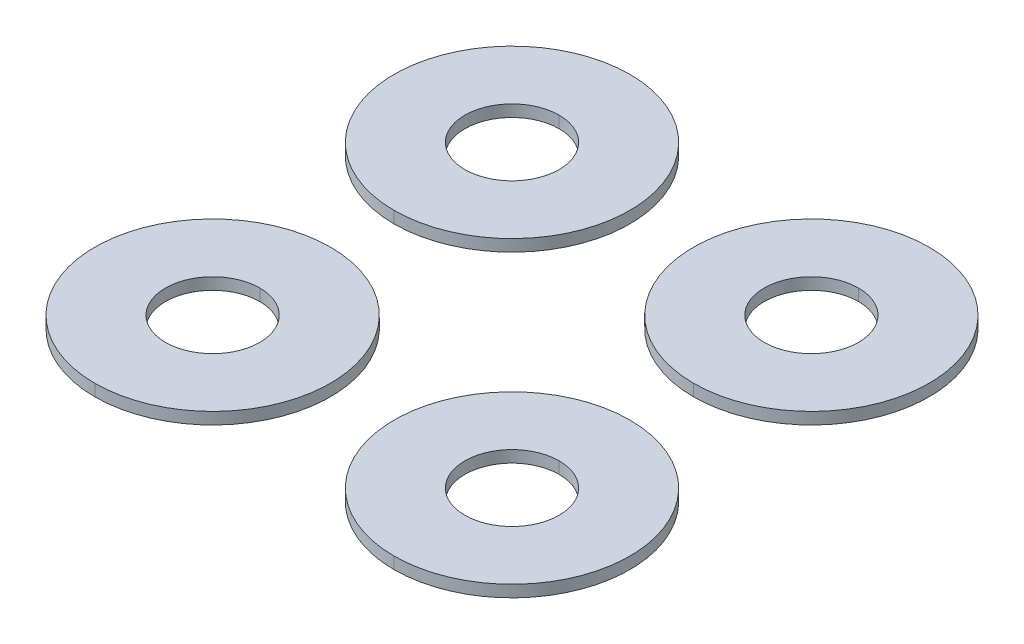
ISO-10303-21;
HEADER;
FILE_DESCRIPTION(('STEP AP214'),'2;1');
FILE_NAME('part.step','',(''),(''),'','','');
FILE_SCHEMA(('AUTOMOTIVE_DESIGN { 1 0 10303 214 1 1 1 1 }'));
ENDSEC;
DATA;
#1=APPLICATION_CONTEXT('core data for automotive mechanical design processes');
#2=APPLICATION_PROTOCOL_DEFINITION('international standard','automotive_design',2000,#1);
#3=PRODUCT_CONTEXT('',#1,'mechanical');
#4=PRODUCT('Part','Part','',(#3));
#5=PRODUCT_RELATED_PRODUCT_CATEGORY('part','',(#4));
#6=PRODUCT_DEFINITION_FORMATION('','',#4);
#7=PRODUCT_DEFINITION_CONTEXT('part definition',#1,'design');
#8=PRODUCT_DEFINITION('design','',#6,#7);
#9=PRODUCT_DEFINITION_SHAPE('','',#8);
#10=(LENGTH_UNIT() NAMED_UNIT(*) SI_UNIT(.MILLI.,.METRE.));
#11=(NAMED_UNIT(*) PLANE_ANGLE_UNIT() SI_UNIT($,.RADIAN.));
#12=(NAMED_UNIT(*) SI_UNIT($,.STERADIAN.) SOLID_ANGLE_UNIT());
#13=UNCERTAINTY_MEASURE_WITH_UNIT(LENGTH_MEASURE(1.E-05),#10,'distance_accuracy_value','');
#14=(GEOMETRIC_REPRESENTATION_CONTEXT(3) GLOBAL_UNCERTAINTY_ASSIGNED_CONTEXT((#13)) GLOBAL_UNIT_ASSIGNED_CONTEXT((#10,
#11,#12)) REPRESENTATION_CONTEXT('',''));
#15=CARTESIAN_POINT('',(0.,0.,0.));
#16=DIRECTION('',(0.,0.,1.));
#17=DIRECTION('',(1.,0.,0.));
#18=AXIS2_PLACEMENT_3D('',#15,#16,#17);
#19=CARTESIAN_POINT('',(0.,0.1,0.));
#20=DIRECTION('',(0.,-1.,0.));
#21=DIRECTION('',(0.,0.,-1.));
#22=AXIS2_PLACEMENT_3D('',#19,#20,#21);
#23=CYLINDRICAL_SURFACE('',#22,0.4);
#24=DIRECTION('',(0.,-1.,0.));
#25=VECTOR('',#24,1.);
#26=CARTESIAN_POINT('',(0.,0.1,0.4));
#27=LINE('',#26,#25);
#28=CARTESIAN_POINT('',(0.,0.1,0.4));
#29=VERTEX_POINT('',#28);
#30=CARTESIAN_POINT('',(0.,0.,0.4));
#31=VERTEX_POINT('',#30);
#32=EDGE_CURVE('P0_E110',#29,#31,#27,.T.);
#33=ORIENTED_EDGE('',*,*,#32,.F.);
#34=CARTESIAN_POINT('',(0.,0.1,0.));
#35=DIRECTION('',(0.,1.,0.));
#36=DIRECTION('',(0.,0.,1.));
#37=AXIS2_PLACEMENT_3D('',#34,#35,#36);
#38=CIRCLE('',#37,0.4);
#39=CARTESIAN_POINT('',(0.,0.1,-0.4));
#40=VERTEX_POINT('',#39);
#41=EDGE_CURVE('P0_E58',#29,#40,#38,.T.);
#42=ORIENTED_EDGE('',*,*,#41,.T.);
#43=DIRECTION('',(0.,-1.,0.));
#44=VECTOR('',#43,1.);
#45=CARTESIAN_POINT('',(0.,0.1,-0.4));
#46=LINE('',#45,#44);
#47=CARTESIAN_POINT('',(0.,0.,-0.4));
#48=VERTEX_POINT('',#47);
#49=EDGE_CURVE('P0_E100',#40,#48,#46,.T.);
#50=ORIENTED_EDGE('',*,*,#49,.T.);
#51=CARTESIAN_POINT('',(0.,0.,0.));
#52=DIRECTION('',(0.,1.,0.));
#53=DIRECTION('',(0.,0.,1.));
#54=AXIS2_PLACEMENT_3D('',#51,#52,#53);
#55=CIRCLE('',#54,0.4);
#56=EDGE_CURVE('P0_E11',#31,#48,#55,.T.);
#57=ORIENTED_EDGE('',*,*,#56,.F.);
#58=EDGE_LOOP('',(#33,#42,#50,#57));
#59=FACE_BOUND('',#58,.T.);
#60=ADVANCED_FACE('P0_F16',(#59),#23,.F.);
#61=CARTESIAN_POINT('',(0.,0.1,0.));
#62=DIRECTION('',(0.,-1.,0.));
#63=DIRECTION('',(0.,0.,-1.));
#64=AXIS2_PLACEMENT_3D('',#61,#62,#63);
#65=CYLINDRICAL_SURFACE('',#64,1.);
#66=DIRECTION('',(0.,-1.,0.));
#67=VECTOR('',#66,1.);
#68=CARTESIAN_POINT('',(0.,0.1,1.));
#69=LINE('',#68,#67);
#70=CARTESIAN_POINT('',(0.,0.1,1.));
#71=VERTEX_POINT('',#70);
#72=CARTESIAN_POINT('',(0.,0.,1.));
#73=VERTEX_POINT('',#72);
#74=EDGE_CURVE('P0_E92',#71,#73,#69,.T.);
#75=ORIENTED_EDGE('',*,*,#74,.F.);
#76=CARTESIAN_POINT('',(0.,0.1,0.));
#77=DIRECTION('',(0.,1.,0.));
#78=DIRECTION('',(0.,0.,1.));
#79=AXIS2_PLACEMENT_3D('',#76,#77,#78);
#80=CIRCLE('',#79,1.);
#81=CARTESIAN_POINT('',(0.,0.1,-1.));
#82=VERTEX_POINT('',#81);
#83=EDGE_CURVE('P0_E78',#82,#71,#80,.T.);
#84=ORIENTED_EDGE('',*,*,#83,.F.);
#85=DIRECTION('',(0.,-1.,0.));
#86=VECTOR('',#85,1.);
#87=CARTESIAN_POINT('',(0.,0.1,-1.));
#88=LINE('',#87,#86);
#89=CARTESIAN_POINT('',(0.,0.,-1.));
#90=VERTEX_POINT('',#89);
#91=EDGE_CURVE('P0_E89',#82,#90,#88,.T.);
#92=ORIENTED_EDGE('',*,*,#91,.T.);
#93=CARTESIAN_POINT('',(0.,0.,0.));
#94=DIRECTION('',(0.,1.,0.));
#95=DIRECTION('',(0.,0.,1.));
#96=AXIS2_PLACEMENT_3D('',#93,#94,#95);
#97=CIRCLE('',#96,1.);
#98=EDGE_CURVE('P0_E27',#90,#73,#97,.T.);
#99=ORIENTED_EDGE('',*,*,#98,.T.);
#100=EDGE_LOOP('',(#75,#84,#92,#99));
#101=FACE_BOUND('',#100,.T.);
#102=ADVANCED_FACE('P0_F18',(#101),#65,.T.);
#103=CARTESIAN_POINT('',(0.,0.,0.));
#104=DIRECTION('',(0.,1.,0.));
#105=DIRECTION('',(1.,0.,0.));
#106=AXIS2_PLACEMENT_3D('',#103,#104,#105);
#107=PLANE('',#106);
#108=CARTESIAN_POINT('',(0.,0.,0.));
#109=DIRECTION('',(0.,1.,0.));
#110=DIRECTION('',(0.,0.,1.));
#111=AXIS2_PLACEMENT_3D('',#108,#109,#110);
#112=CIRCLE('',#111,0.4);
#113=EDGE_CURVE('P0_E20',#48,#31,#112,.T.);
#114=ORIENTED_EDGE('',*,*,#113,.T.);
#115=ORIENTED_EDGE('',*,*,#56,.T.);
#116=EDGE_LOOP('',(#114,#115));
#117=FACE_BOUND('',#116,.T.);
#118=ORIENTED_EDGE('',*,*,#98,.F.);
#119=CARTESIAN_POINT('',(0.,0.,0.));
#120=DIRECTION('',(0.,1.,0.));
#121=DIRECTION('',(0.,0.,1.));
#122=AXIS2_PLACEMENT_3D('',#119,#120,#121);
#123=CIRCLE('',#122,1.);
#124=EDGE_CURVE('P0_E96',#73,#90,#123,.T.);
#125=ORIENTED_EDGE('',*,*,#124,.F.);
#126=EDGE_LOOP('',(#118,#125));
#127=FACE_BOUND('',#126,.T.);
#128=ADVANCED_FACE('P0_F140',(#117,#127),#107,.F.);
#129=CARTESIAN_POINT('',(0.,0.1,0.));
#130=DIRECTION('',(0.,1.,0.));
#131=DIRECTION('',(1.,0.,0.));
#132=AXIS2_PLACEMENT_3D('',#129,#130,#131);
#133=PLANE('',#132);
#134=CARTESIAN_POINT('',(0.,0.1,0.));
#135=DIRECTION('',(0.,1.,0.));
#136=DIRECTION('',(0.,0.,1.));
#137=AXIS2_PLACEMENT_3D('',#134,#135,#136);
#138=CIRCLE('',#137,0.4);
#139=EDGE_CURVE('P0_E107',#40,#29,#138,.T.);
#140=ORIENTED_EDGE('',*,*,#139,.F.);
#141=ORIENTED_EDGE('',*,*,#41,.F.);
#142=EDGE_LOOP('',(#140,#141));
#143=FACE_BOUND('',#142,.T.);
#144=ORIENTED_EDGE('',*,*,#83,.T.);
#145=CARTESIAN_POINT('',(0.,0.1,0.));
#146=DIRECTION('',(0.,1.,0.));
#147=DIRECTION('',(0.,0.,1.));
#148=AXIS2_PLACEMENT_3D('',#145,#146,#147);
#149=CIRCLE('',#148,1.);
#150=EDGE_CURVE('P0_E87',#71,#82,#149,.T.);
#151=ORIENTED_EDGE('',*,*,#150,.T.);
#152=EDGE_LOOP('',(#144,#151));
#153=FACE_BOUND('',#152,.T.);
#154=ADVANCED_FACE('P0_F85',(#143,#153),#133,.T.);
#155=CARTESIAN_POINT('',(0.,0.1,0.));
#156=DIRECTION('',(0.,-1.,0.));
#157=DIRECTION('',(0.,0.,-1.));
#158=AXIS2_PLACEMENT_3D('',#155,#156,#157);
#159=CYLINDRICAL_SURFACE('',#158,1.);
#160=ORIENTED_EDGE('',*,*,#150,.F.);
#161=ORIENTED_EDGE('',*,*,#74,.T.);
#162=ORIENTED_EDGE('',*,*,#124,.T.);
#163=ORIENTED_EDGE('',*,*,#91,.F.);
#164=EDGE_LOOP('',(#160,#161,#162,#163));
#165=FACE_BOUND('',#164,.T.);
#166=ADVANCED_FACE('P0_F98',(#165),#159,.T.);
#167=CARTESIAN_POINT('',(0.,0.1,0.));
#168=DIRECTION('',(0.,-1.,0.));
#169=DIRECTION('',(0.,0.,-1.));
#170=AXIS2_PLACEMENT_3D('',#167,#168,#169);
#171=CYLINDRICAL_SURFACE('',#170,0.4);
#172=ORIENTED_EDGE('',*,*,#139,.T.);
#173=ORIENTED_EDGE('',*,*,#32,.T.);
#174=ORIENTED_EDGE('',*,*,#113,.F.);
#175=ORIENTED_EDGE('',*,*,#49,.F.);
#176=EDGE_LOOP('',(#172,#173,#174,#175));
#177=FACE_BOUND('',#176,.T.);
#178=ADVANCED_FACE('P0_F150',(#177),#171,.F.);
#179=CLOSED_SHELL('',(#60,#102,#128,#154,#166,#178));
#180=MANIFOLD_SOLID_BREP('P0_B1',#179);
#181=CARTESIAN_POINT('',(0.,0.1,-2.54));
#182=DIRECTION('',(0.,-1.,0.));
#183=DIRECTION('',(0.,0.,-1.));
#184=AXIS2_PLACEMENT_3D('',#181,#182,#183);
#185=CYLINDRICAL_SURFACE('',#184,0.4);
#186=DIRECTION('',(0.,-1.,0.));
#187=VECTOR('',#186,1.);
#188=CARTESIAN_POINT('',(0.,0.1,-2.14));
#189=LINE('',#188,#187);
#190=CARTESIAN_POINT('',(0.,0.1,-2.14));
#191=VERTEX_POINT('',#190);
#192=CARTESIAN_POINT('',(0.,0.,-2.14));
#193=VERTEX_POINT('',#192);
#194=EDGE_CURVE('P1_E117',#191,#193,#189,.T.);
#195=ORIENTED_EDGE('',*,*,#194,.F.);
#196=CARTESIAN_POINT('',(0.,0.1,-2.54));
#197=DIRECTION('',(0.,1.,0.));
#198=DIRECTION('',(0.,0.,1.));
#199=AXIS2_PLACEMENT_3D('',#196,#197,#198);
#200=CIRCLE('',#199,0.4);
#201=CARTESIAN_POINT('',(0.,0.1,-2.94));
#202=VERTEX_POINT('',#201);
#203=EDGE_CURVE('P1_E59',#191,#202,#200,.T.);
#204=ORIENTED_EDGE('',*,*,#203,.T.);
#205=DIRECTION('',(0.,-1.,0.));
#206=VECTOR('',#205,1.);
#207=CARTESIAN_POINT('',(0.,0.1,-2.94));
#208=LINE('',#207,#206);
#209=CARTESIAN_POINT('',(0.,0.,-2.94));
#210=VERTEX_POINT('',#209);
#211=EDGE_CURVE('P1_E96',#202,#210,#208,.T.);
#212=ORIENTED_EDGE('',*,*,#211,.T.);
#213=CARTESIAN_POINT('',(0.,0.,-2.54));
#214=DIRECTION('',(0.,1.,0.));
#215=DIRECTION('',(0.,0.,1.));
#216=AXIS2_PLACEMENT_3D('',#213,#214,#215);
#217=CIRCLE('',#216,0.4);
#218=EDGE_CURVE('P1_E11',#193,#210,#217,.T.);
#219=ORIENTED_EDGE('',*,*,#218,.F.);
#220=EDGE_LOOP('',(#195,#204,#212,#219));
#221=FACE_BOUND('',#220,.T.);
#222=ADVANCED_FACE('P1_F16',(#221),#185,.F.);
#223=CARTESIAN_POINT('',(0.,0.1,-2.54));
#224=DIRECTION('',(0.,-1.,0.));
#225=DIRECTION('',(0.,0.,-1.));
#226=AXIS2_PLACEMENT_3D('',#223,#224,#225);
#227=CYLINDRICAL_SURFACE('',#226,1.);
#228=DIRECTION('',(0.,-1.,0.));
#229=VECTOR('',#228,1.);
#230=CARTESIAN_POINT('',(0.,0.1,-1.54));
#231=LINE('',#230,#229);
#232=CARTESIAN_POINT('',(0.,0.1,-1.54));
#233=VERTEX_POINT('',#232);
#234=CARTESIAN_POINT('',(0.,0.,-1.54));
#235=VERTEX_POINT('',#234);
#236=EDGE_CURVE('P1_E83',#233,#235,#231,.T.);
#237=ORIENTED_EDGE('',*,*,#236,.F.);
#238=CARTESIAN_POINT('',(0.,0.1,-2.54));
#239=DIRECTION('',(0.,1.,0.));
#240=DIRECTION('',(0.,0.,1.));
#241=AXIS2_PLACEMENT_3D('',#238,#239,#240);
#242=CIRCLE('',#241,1.);
#243=CARTESIAN_POINT('',(0.,0.1,-3.54));
#244=VERTEX_POINT('',#243);
#245=EDGE_CURVE('P1_E78',#244,#233,#242,.T.);
#246=ORIENTED_EDGE('',*,*,#245,.F.);
#247=DIRECTION('',(0.,-1.,0.));
#248=VECTOR('',#247,1.);
#249=CARTESIAN_POINT('',(0.,0.1,-3.54));
#250=LINE('',#249,#248);
#251=CARTESIAN_POINT('',(0.,0.,-3.54));
#252=VERTEX_POINT('',#251);
#253=EDGE_CURVE('P1_E20',#244,#252,#250,.T.);
#254=ORIENTED_EDGE('',*,*,#253,.T.);
#255=CARTESIAN_POINT('',(0.,0.,-2.54));
#256=DIRECTION('',(0.,1.,0.));
#257=DIRECTION('',(0.,0.,1.));
#258=AXIS2_PLACEMENT_3D('',#255,#256,#257);
#259=CIRCLE('',#258,1.);
#260=EDGE_CURVE('P1_E27',#252,#235,#259,.T.);
#261=ORIENTED_EDGE('',*,*,#260,.T.);
#262=EDGE_LOOP('',(#237,#246,#254,#261));
#263=FACE_BOUND('',#262,.T.);
#264=ADVANCED_FACE('P1_F80',(#263),#227,.T.);
#265=CARTESIAN_POINT('',(0.,0.,-2.54));
#266=DIRECTION('',(0.,1.,0.));
#267=DIRECTION('',(1.,0.,0.));
#268=AXIS2_PLACEMENT_3D('',#265,#266,#267);
#269=PLANE('',#268);
#270=CARTESIAN_POINT('',(0.,0.,-2.54));
#271=DIRECTION('',(0.,1.,0.));
#272=DIRECTION('',(0.,0.,1.));
#273=AXIS2_PLACEMENT_3D('',#270,#271,#272);
#274=CIRCLE('',#273,0.4);
#275=EDGE_CURVE('P1_E104',#210,#193,#274,.T.);
#276=ORIENTED_EDGE('',*,*,#275,.T.);
#277=ORIENTED_EDGE('',*,*,#218,.T.);
#278=EDGE_LOOP('',(#276,#277));
#279=FACE_BOUND('',#278,.T.);
#280=ORIENTED_EDGE('',*,*,#260,.F.);
#281=CARTESIAN_POINT('',(0.,0.,-2.54));
#282=DIRECTION('',(0.,1.,0.));
#283=DIRECTION('',(0.,0.,1.));
#284=AXIS2_PLACEMENT_3D('',#281,#282,#283);
#285=CIRCLE('',#284,1.);
#286=EDGE_CURVE('P1_E92',#235,#252,#285,.T.);
#287=ORIENTED_EDGE('',*,*,#286,.F.);
#288=EDGE_LOOP('',(#280,#287));
#289=FACE_BOUND('',#288,.T.);
#290=ADVANCED_FACE('P1_F18',(#279,#289),#269,.F.);
#291=CARTESIAN_POINT('',(0.,0.1,-2.54));
#292=DIRECTION('',(0.,1.,0.));
#293=DIRECTION('',(1.,0.,0.));
#294=AXIS2_PLACEMENT_3D('',#291,#292,#293);
#295=PLANE('',#294);
#296=CARTESIAN_POINT('',(0.,0.1,-2.54));
#297=DIRECTION('',(0.,1.,0.));
#298=DIRECTION('',(0.,0.,1.));
#299=AXIS2_PLACEMENT_3D('',#296,#297,#298);
#300=CIRCLE('',#299,0.4);
#301=EDGE_CURVE('P1_E115',#202,#191,#300,.T.);
#302=ORIENTED_EDGE('',*,*,#301,.F.);
#303=ORIENTED_EDGE('',*,*,#203,.F.);
#304=EDGE_LOOP('',(#302,#303));
#305=FACE_BOUND('',#304,.T.);
#306=ORIENTED_EDGE('',*,*,#245,.T.);
#307=CARTESIAN_POINT('',(0.,0.1,-2.54));
#308=DIRECTION('',(0.,1.,0.));
#309=DIRECTION('',(0.,0.,1.));
#310=AXIS2_PLACEMENT_3D('',#307,#308,#309);
#311=CIRCLE('',#310,1.);
#312=EDGE_CURVE('P1_E91',#233,#244,#311,.T.);
#313=ORIENTED_EDGE('',*,*,#312,.T.);
#314=EDGE_LOOP('',(#306,#313));
#315=FACE_BOUND('',#314,.T.);
#316=ADVANCED_FACE('P1_F94',(#305,#315),#295,.T.);
#317=CARTESIAN_POINT('',(0.,0.1,-2.54));
#318=DIRECTION('',(0.,-1.,0.));
#319=DIRECTION('',(0.,0.,-1.));
#320=AXIS2_PLACEMENT_3D('',#317,#318,#319);
#321=CYLINDRICAL_SURFACE('',#320,1.);
#322=ORIENTED_EDGE('',*,*,#312,.F.);
#323=ORIENTED_EDGE('',*,*,#236,.T.);
#324=ORIENTED_EDGE('',*,*,#286,.T.);
#325=ORIENTED_EDGE('',*,*,#253,.F.);
#326=EDGE_LOOP('',(#322,#323,#324,#325));
#327=FACE_BOUND('',#326,.T.);
#328=ADVANCED_FACE('P1_F90',(#327),#321,.T.);
#329=CARTESIAN_POINT('',(0.,0.1,-2.54));
#330=DIRECTION('',(0.,-1.,0.));
#331=DIRECTION('',(0.,0.,-1.));
#332=AXIS2_PLACEMENT_3D('',#329,#330,#331);
#333=CYLINDRICAL_SURFACE('',#332,0.4);
#334=ORIENTED_EDGE('',*,*,#301,.T.);
#335=ORIENTED_EDGE('',*,*,#194,.T.);
#336=ORIENTED_EDGE('',*,*,#275,.F.);
#337=ORIENTED_EDGE('',*,*,#211,.F.);
#338=EDGE_LOOP('',(#334,#335,#336,#337));
#339=FACE_BOUND('',#338,.T.);
#340=ADVANCED_FACE('P1_F167',(#339),#333,.F.);
#341=CLOSED_SHELL('',(#222,#264,#290,#316,#328,#340));
#342=MANIFOLD_SOLID_BREP('P1_B1',#341);
#343=CARTESIAN_POINT('',(2.54,0.1,-2.54));
#344=DIRECTION('',(0.,-1.,0.));
#345=DIRECTION('',(0.,0.,-1.));
#346=AXIS2_PLACEMENT_3D('',#343,#344,#345);
#347=CYLINDRICAL_SURFACE('',#346,0.4);
#348=DIRECTION('',(0.,-1.,0.));
#349=VECTOR('',#348,1.);
#350=CARTESIAN_POINT('',(2.54,0.1,-2.14));
#351=LINE('',#350,#349);
#352=CARTESIAN_POINT('',(2.54,0.1,-2.14));
#353=VERTEX_POINT('',#352);
#354=CARTESIAN_POINT('',(2.54,0.,-2.14));
#355=VERTEX_POINT('',#354);
#356=EDGE_CURVE('P2_E82',#353,#355,#351,.T.);
#357=ORIENTED_EDGE('',*,*,#356,.F.);
#358=CARTESIAN_POINT('',(2.54,0.1,-2.54));
#359=DIRECTION('',(0.,1.,0.));
#360=DIRECTION('',(0.,0.,1.));
#361=AXIS2_PLACEMENT_3D('',#358,#359,#360);
#362=CIRCLE('',#361,0.4);
#363=CARTESIAN_POINT('',(2.54,0.1,-2.94));
#364=VERTEX_POINT('',#363);
#365=EDGE_CURVE('P2_E71',#353,#364,#362,.T.);
#366=ORIENTED_EDGE('',*,*,#365,.T.);
#367=DIRECTION('',(0.,-1.,0.));
#368=VECTOR('',#367,1.);
#369=CARTESIAN_POINT('',(2.54,0.1,-2.94));
#370=LINE('',#369,#368);
#371=CARTESIAN_POINT('',(2.54,0.,-2.94));
#372=VERTEX_POINT('',#371);
#373=EDGE_CURVE('P2_E79',#364,#372,#370,.T.);
#374=ORIENTED_EDGE('',*,*,#373,.T.);
#375=CARTESIAN_POINT('',(2.54,0.,-2.54));
#376=DIRECTION('',(0.,1.,0.));
#377=DIRECTION('',(0.,0.,1.));
#378=AXIS2_PLACEMENT_3D('',#375,#376,#377);
#379=CIRCLE('',#378,0.4);
#380=EDGE_CURVE('P2_E11',#355,#372,#379,.T.);
#381=ORIENTED_EDGE('',*,*,#380,.F.);
#382=EDGE_LOOP('',(#357,#366,#374,#381));
#383=FACE_BOUND('',#382,.T.);
#384=ADVANCED_FACE('P2_F16',(#383),#347,.F.);
#385=CARTESIAN_POINT('',(2.54,0.1,-2.54));
#386=DIRECTION('',(0.,-1.,0.));
#387=DIRECTION('',(0.,0.,-1.));
#388=AXIS2_PLACEMENT_3D('',#385,#386,#387);
#389=CYLINDRICAL_SURFACE('',#388,1.);
#390=DIRECTION('',(0.,-1.,0.));
#391=VECTOR('',#390,1.);
#392=CARTESIAN_POINT('',(2.54,0.1,-1.54));
#393=LINE('',#392,#391);
#394=CARTESIAN_POINT('',(2.54,0.1,-1.54));
#395=VERTEX_POINT('',#394);
#396=CARTESIAN_POINT('',(2.54,0.,-1.54));
#397=VERTEX_POINT('',#396);
#398=EDGE_CURVE('P2_E113',#395,#397,#393,.T.);
#399=ORIENTED_EDGE('',*,*,#398,.F.);
#400=CARTESIAN_POINT('',(2.54,0.1,-2.54));
#401=DIRECTION('',(0.,1.,0.));
#402=DIRECTION('',(0.,0.,1.));
#403=AXIS2_PLACEMENT_3D('',#400,#401,#402);
#404=CIRCLE('',#403,1.);
#405=CARTESIAN_POINT('',(2.54,0.1,-3.54));
#406=VERTEX_POINT('',#405);
#407=EDGE_CURVE('P2_E20',#406,#395,#404,.T.);
#408=ORIENTED_EDGE('',*,*,#407,.F.);
#409=DIRECTION('',(0.,-1.,0.));
#410=VECTOR('',#409,1.);
#411=CARTESIAN_POINT('',(2.54,0.1,-3.54));
#412=LINE('',#411,#410);
#413=CARTESIAN_POINT('',(2.54,0.,-3.54));
#414=VERTEX_POINT('',#413);
#415=EDGE_CURVE('P2_E104',#406,#414,#412,.T.);
#416=ORIENTED_EDGE('',*,*,#415,.T.);
#417=CARTESIAN_POINT('',(2.54,0.,-2.54));
#418=DIRECTION('',(0.,1.,0.));
#419=DIRECTION('',(0.,0.,1.));
#420=AXIS2_PLACEMENT_3D('',#417,#418,#419);
#421=CIRCLE('',#420,1.);
#422=EDGE_CURVE('P2_E26',#414,#397,#421,.T.);
#423=ORIENTED_EDGE('',*,*,#422,.T.);
#424=EDGE_LOOP('',(#399,#408,#416,#423));
#425=FACE_BOUND('',#424,.T.);
#426=ADVANCED_FACE('P2_F18',(#425),#389,.T.);
#427=CARTESIAN_POINT('',(2.54,0.,-2.54));
#428=DIRECTION('',(0.,1.,0.));
#429=DIRECTION('',(1.,0.,0.));
#430=AXIS2_PLACEMENT_3D('',#427,#428,#429);
#431=PLANE('',#430);
#432=CARTESIAN_POINT('',(2.54,0.,-2.54));
#433=DIRECTION('',(0.,1.,0.));
#434=DIRECTION('',(0.,0.,1.));
#435=AXIS2_PLACEMENT_3D('',#432,#433,#434);
#436=CIRCLE('',#435,0.4);
#437=EDGE_CURVE('P2_E90',#372,#355,#436,.T.);
#438=ORIENTED_EDGE('',*,*,#437,.T.);
#439=ORIENTED_EDGE('',*,*,#380,.T.);
#440=EDGE_LOOP('',(#438,#439));
#441=FACE_BOUND('',#440,.T.);
#442=ORIENTED_EDGE('',*,*,#422,.F.);
#443=CARTESIAN_POINT('',(2.54,0.,-2.54));
#444=DIRECTION('',(0.,1.,0.));
#445=DIRECTION('',(0.,0.,1.));
#446=AXIS2_PLACEMENT_3D('',#443,#444,#445);
#447=CIRCLE('',#446,1.);
#448=EDGE_CURVE('P2_E106',#397,#414,#447,.T.);
#449=ORIENTED_EDGE('',*,*,#448,.F.);
#450=EDGE_LOOP('',(#442,#449));
#451=FACE_BOUND('',#450,.T.);
#452=ADVANCED_FACE('P2_F131',(#441,#451),#431,.F.);
#453=CARTESIAN_POINT('',(2.54,0.1,-2.54));
#454=DIRECTION('',(0.,1.,0.));
#455=DIRECTION('',(1.,0.,0.));
#456=AXIS2_PLACEMENT_3D('',#453,#454,#455);
#457=PLANE('',#456);
#458=CARTESIAN_POINT('',(2.54,0.1,-2.54));
#459=DIRECTION('',(0.,1.,0.));
#460=DIRECTION('',(0.,0.,1.));
#461=AXIS2_PLACEMENT_3D('',#458,#459,#460);
#462=CIRCLE('',#461,0.4);
#463=EDGE_CURVE('P2_E88',#364,#353,#462,.T.);
#464=ORIENTED_EDGE('',*,*,#463,.F.);
#465=ORIENTED_EDGE('',*,*,#365,.F.);
#466=EDGE_LOOP('',(#464,#465));
#467=FACE_BOUND('',#466,.T.);
#468=ORIENTED_EDGE('',*,*,#407,.T.);
#469=CARTESIAN_POINT('',(2.54,0.1,-2.54));
#470=DIRECTION('',(0.,1.,0.));
#471=DIRECTION('',(0.,0.,1.));
#472=AXIS2_PLACEMENT_3D('',#469,#470,#471);
#473=CIRCLE('',#472,1.);
#474=EDGE_CURVE('P2_E92',#395,#406,#473,.T.);
#475=ORIENTED_EDGE('',*,*,#474,.T.);
#476=EDGE_LOOP('',(#468,#475));
#477=FACE_BOUND('',#476,.T.);
#478=ADVANCED_FACE('P2_F94',(#467,#477),#457,.T.);
#479=CARTESIAN_POINT('',(2.54,0.1,-2.54));
#480=DIRECTION('',(0.,-1.,0.));
#481=DIRECTION('',(0.,0.,-1.));
#482=AXIS2_PLACEMENT_3D('',#479,#480,#481);
#483=CYLINDRICAL_SURFACE('',#482,1.);
#484=ORIENTED_EDGE('',*,*,#474,.F.);
#485=ORIENTED_EDGE('',*,*,#398,.T.);
#486=ORIENTED_EDGE('',*,*,#448,.T.);
#487=ORIENTED_EDGE('',*,*,#415,.F.);
#488=EDGE_LOOP('',(#484,#485,#486,#487));
#489=FACE_BOUND('',#488,.T.);
#490=ADVANCED_FACE('P2_F129',(#489),#483,.T.);
#491=CARTESIAN_POINT('',(2.54,0.1,-2.54));
#492=DIRECTION('',(0.,-1.,0.));
#493=DIRECTION('',(0.,0.,-1.));
#494=AXIS2_PLACEMENT_3D('',#491,#492,#493);
#495=CYLINDRICAL_SURFACE('',#494,0.4);
#496=ORIENTED_EDGE('',*,*,#463,.T.);
#497=ORIENTED_EDGE('',*,*,#356,.T.);
#498=ORIENTED_EDGE('',*,*,#437,.F.);
#499=ORIENTED_EDGE('',*,*,#373,.F.);
#500=EDGE_LOOP('',(#496,#497,#498,#499));
#501=FACE_BOUND('',#500,.T.);
#502=ADVANCED_FACE('P2_F87',(#501),#495,.F.);
#503=CLOSED_SHELL('',(#384,#426,#452,#478,#490,#502));
#504=MANIFOLD_SOLID_BREP('P2_B1',#503);
#505=CARTESIAN_POINT('',(2.54,0.1,0.));
#506=DIRECTION('',(0.,-1.,0.));
#507=DIRECTION('',(0.,0.,-1.));
#508=AXIS2_PLACEMENT_3D('',#505,#506,#507);
#509=CYLINDRICAL_SURFACE('',#508,0.4);
#510=DIRECTION('',(0.,-1.,0.));
#511=VECTOR('',#510,1.);
#512=CARTESIAN_POINT('',(2.54,0.1,0.4));
#513=LINE('',#512,#511);
#514=CARTESIAN_POINT('',(2.54,0.1,0.4));
#515=VERTEX_POINT('',#514);
#516=CARTESIAN_POINT('',(2.54,0.,0.4));
#517=VERTEX_POINT('',#516);
#518=EDGE_CURVE('P3_E101',#515,#517,#513,.T.);
#519=ORIENTED_EDGE('',*,*,#518,.F.);
#520=CARTESIAN_POINT('',(2.54,0.1,0.));
#521=DIRECTION('',(0.,1.,0.));
#522=DIRECTION('',(0.,0.,1.));
#523=AXIS2_PLACEMENT_3D('',#520,#521,#522);
#524=CIRCLE('',#523,0.4);
#525=CARTESIAN_POINT('',(2.54,0.1,-0.4));
#526=VERTEX_POINT('',#525);
#527=EDGE_CURVE('P3_E75',#515,#526,#524,.T.);
#528=ORIENTED_EDGE('',*,*,#527,.T.);
#529=DIRECTION('',(0.,-1.,0.));
#530=VECTOR('',#529,1.);
#531=CARTESIAN_POINT('',(2.54,0.1,-0.4));
#532=LINE('',#531,#530);
#533=CARTESIAN_POINT('',(2.54,0.,-0.4));
#534=VERTEX_POINT('',#533);
#535=EDGE_CURVE('P3_E84',#526,#534,#532,.T.);
#536=ORIENTED_EDGE('',*,*,#535,.T.);
#537=CARTESIAN_POINT('',(2.54,0.,0.));
#538=DIRECTION('',(0.,1.,0.));
#539=DIRECTION('',(0.,0.,1.));
#540=AXIS2_PLACEMENT_3D('',#537,#538,#539);
#541=CIRCLE('',#540,0.4);
#542=EDGE_CURVE('P3_E11',#517,#534,#541,.T.);
#543=ORIENTED_EDGE('',*,*,#542,.F.);
#544=EDGE_LOOP('',(#519,#528,#536,#543));
#545=FACE_BOUND('',#544,.T.);
#546=ADVANCED_FACE('P3_F16',(#545),#509,.F.);
#547=CARTESIAN_POINT('',(2.54,0.1,0.));
#548=DIRECTION('',(0.,-1.,0.));
#549=DIRECTION('',(0.,0.,-1.));
#550=AXIS2_PLACEMENT_3D('',#547,#548,#549);
#551=CYLINDRICAL_SURFACE('',#550,1.);
#552=DIRECTION('',(0.,-1.,0.));
#553=VECTOR('',#552,1.);
#554=CARTESIAN_POINT('',(2.54,0.1,1.));
#555=LINE('',#554,#553);
#556=CARTESIAN_POINT('',(2.54,0.1,1.));
#557=VERTEX_POINT('',#556);
#558=CARTESIAN_POINT('',(2.54,0.,1.));
#559=VERTEX_POINT('',#558);
#560=EDGE_CURVE('P3_E70',#557,#559,#555,.T.);
#561=ORIENTED_EDGE('',*,*,#560,.F.);
#562=CARTESIAN_POINT('',(2.54,0.1,0.));
#563=DIRECTION('',(0.,1.,0.));
#564=DIRECTION('',(0.,0.,1.));
#565=AXIS2_PLACEMENT_3D('',#562,#563,#564);
#566=CIRCLE('',#565,1.);
#567=CARTESIAN_POINT('',(2.54,0.1,-1.));
#568=VERTEX_POINT('',#567);
#569=EDGE_CURVE('P3_E64',#568,#557,#566,.T.);
#570=ORIENTED_EDGE('',*,*,#569,.F.);
#571=DIRECTION('',(0.,-1.,0.));
#572=VECTOR('',#571,1.);
#573=CARTESIAN_POINT('',(2.54,0.1,-1.));
#574=LINE('',#573,#572);
#575=CARTESIAN_POINT('',(2.54,0.,-1.));
#576=VERTEX_POINT('',#575);
#577=EDGE_CURVE('P3_E67',#568,#576,#574,.T.);
#578=ORIENTED_EDGE('',*,*,#577,.T.);
#579=CARTESIAN_POINT('',(2.54,0.,0.));
#580=DIRECTION('',(0.,1.,0.));
#581=DIRECTION('',(0.,0.,1.));
#582=AXIS2_PLACEMENT_3D('',#579,#580,#581);
#583=CIRCLE('',#582,1.);
#584=EDGE_CURVE('P3_E25',#576,#559,#583,.T.);
#585=ORIENTED_EDGE('',*,*,#584,.T.);
#586=EDGE_LOOP('',(#561,#570,#578,#585));
#587=FACE_BOUND('',#586,.T.);
#588=ADVANCED_FACE('P3_F66',(#587),#551,.T.);
#589=CARTESIAN_POINT('',(2.54,0.,0.));
#590=DIRECTION('',(0.,1.,0.));
#591=DIRECTION('',(1.,0.,0.));
#592=AXIS2_PLACEMENT_3D('',#589,#590,#591);
#593=PLANE('',#592);
#594=CARTESIAN_POINT('',(2.54,0.,0.));
#595=DIRECTION('',(0.,1.,0.));
#596=DIRECTION('',(0.,0.,1.));
#597=AXIS2_PLACEMENT_3D('',#594,#595,#596);
#598=CIRCLE('',#597,0.4);
#599=EDGE_CURVE('P3_E93',#534,#517,#598,.T.);
#600=ORIENTED_EDGE('',*,*,#599,.T.);
#601=ORIENTED_EDGE('',*,*,#542,.T.);
#602=EDGE_LOOP('',(#600,#601));
#603=FACE_BOUND('',#602,.T.);
#604=ORIENTED_EDGE('',*,*,#584,.F.);
#605=CARTESIAN_POINT('',(2.54,0.,0.));
#606=DIRECTION('',(0.,1.,0.));
#607=DIRECTION('',(0.,0.,1.));
#608=AXIS2_PLACEMENT_3D('',#605,#606,#607);
#609=CIRCLE('',#608,1.);
#610=EDGE_CURVE('P3_E80',#559,#576,#609,.T.);
#611=ORIENTED_EDGE('',*,*,#610,.F.);
#612=EDGE_LOOP('',(#604,#611));
#613=FACE_BOUND('',#612,.T.);
#614=ADVANCED_FACE('P3_F121',(#603,#613),#593,.F.);
#615=CARTESIAN_POINT('',(2.54,0.1,0.));
#616=DIRECTION('',(0.,1.,0.));
#617=DIRECTION('',(1.,0.,0.));
#618=AXIS2_PLACEMENT_3D('',#615,#616,#617);
#619=PLANE('',#618);
#620=CARTESIAN_POINT('',(2.54,0.1,0.));
#621=DIRECTION('',(0.,1.,0.));
#622=DIRECTION('',(0.,0.,1.));
#623=AXIS2_PLACEMENT_3D('',#620,#621,#622);
#624=CIRCLE('',#623,0.4);
#625=EDGE_CURVE('P3_E97',#526,#515,#624,.T.);
#626=ORIENTED_EDGE('',*,*,#625,.F.);
#627=ORIENTED_EDGE('',*,*,#527,.F.);
#628=EDGE_LOOP('',(#626,#627));
#629=FACE_BOUND('',#628,.T.);
#630=ORIENTED_EDGE('',*,*,#569,.T.);
#631=CARTESIAN_POINT('',(2.54,0.1,0.));
#632=DIRECTION('',(0.,1.,0.));
#633=DIRECTION('',(0.,0.,1.));
#634=AXIS2_PLACEMENT_3D('',#631,#632,#633);
#635=CIRCLE('',#634,1.);
#636=EDGE_CURVE('P3_E79',#557,#568,#635,.T.);
#637=ORIENTED_EDGE('',*,*,#636,.T.);
#638=EDGE_LOOP('',(#630,#637));
#639=FACE_BOUND('',#638,.T.);
#640=ADVANCED_FACE('P3_F82',(#629,#639),#619,.T.);
#641=CARTESIAN_POINT('',(2.54,0.1,0.));
#642=DIRECTION('',(0.,-1.,0.));
#643=DIRECTION('',(0.,0.,-1.));
#644=AXIS2_PLACEMENT_3D('',#641,#642,#643);
#645=CYLINDRICAL_SURFACE('',#644,1.);
#646=ORIENTED_EDGE('',*,*,#636,.F.);
#647=ORIENTED_EDGE('',*,*,#560,.T.);
#648=ORIENTED_EDGE('',*,*,#610,.T.);
#649=ORIENTED_EDGE('',*,*,#577,.F.);
#650=EDGE_LOOP('',(#646,#647,#648,#649));
#651=FACE_BOUND('',#650,.T.);
#652=ADVANCED_FACE('P3_F78',(#651),#645,.T.);
#653=CARTESIAN_POINT('',(2.54,0.1,0.));
#654=DIRECTION('',(0.,-1.,0.));
#655=DIRECTION('',(0.,0.,-1.));
#656=AXIS2_PLACEMENT_3D('',#653,#654,#655);
#657=CYLINDRICAL_SURFACE('',#656,0.4);
#658=ORIENTED_EDGE('',*,*,#625,.T.);
#659=ORIENTED_EDGE('',*,*,#518,.T.);
#660=ORIENTED_EDGE('',*,*,#599,.F.);
#661=ORIENTED_EDGE('',*,*,#535,.F.);
#662=EDGE_LOOP('',(#658,#659,#660,#661));
#663=FACE_BOUND('',#662,.T.);
#664=ADVANCED_FACE('P3_F116',(#663),#657,.F.);
#665=CLOSED_SHELL('',(#546,#588,#614,#640,#652,#664));
#666=MANIFOLD_SOLID_BREP('P3_B1',#665);
#667=ADVANCED_BREP_SHAPE_REPRESENTATION('',(#18,#180,#342,#504,#666),#14);
#668=SHAPE_DEFINITION_REPRESENTATION(#9,#667);
ENDSEC;
END-ISO-10303-21;
